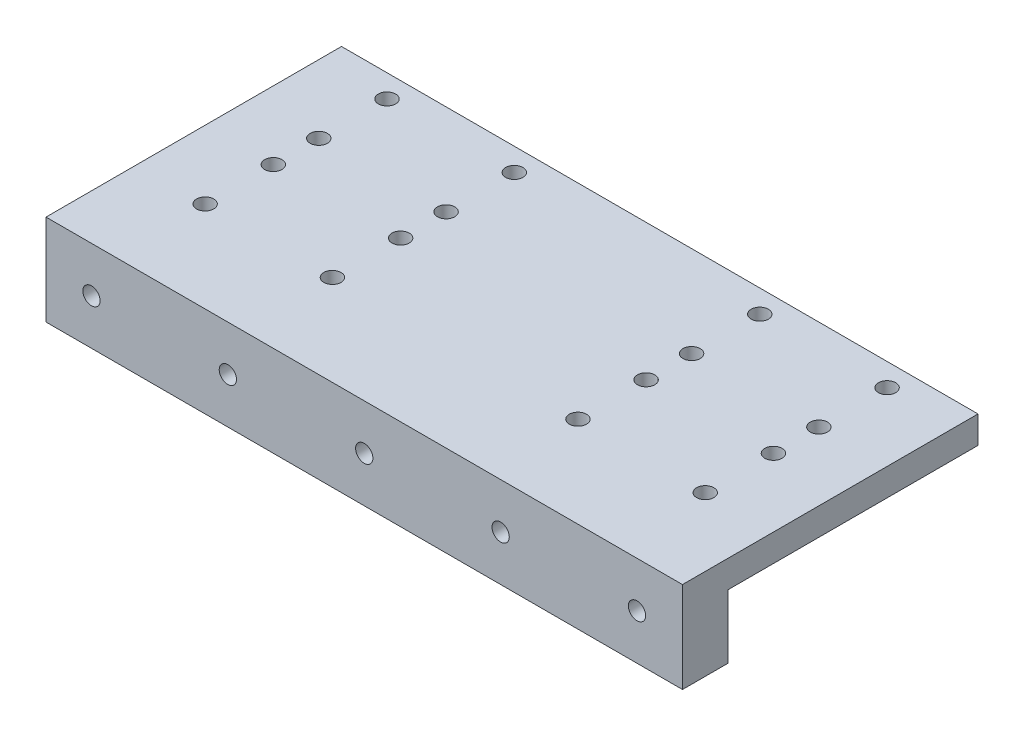
ISO-10303-21;
HEADER;
FILE_DESCRIPTION(('STEP AP214'),'2;1');
FILE_NAME('part.step','',(''),(''),'','','');
FILE_SCHEMA(('AUTOMOTIVE_DESIGN { 1 0 10303 214 1 1 1 1 }'));
ENDSEC;
DATA;
#1=APPLICATION_CONTEXT('core data for automotive mechanical design processes');
#2=APPLICATION_PROTOCOL_DEFINITION('international standard','automotive_design',2000,#1);
#3=PRODUCT_CONTEXT('',#1,'mechanical');
#4=PRODUCT('Part','Part','',(#3));
#5=PRODUCT_RELATED_PRODUCT_CATEGORY('part','',(#4));
#6=PRODUCT_DEFINITION_FORMATION('','',#4);
#7=PRODUCT_DEFINITION_CONTEXT('part definition',#1,'design');
#8=PRODUCT_DEFINITION('design','',#6,#7);
#9=PRODUCT_DEFINITION_SHAPE('','',#8);
#10=(LENGTH_UNIT() NAMED_UNIT(*) SI_UNIT(.MILLI.,.METRE.));
#11=(NAMED_UNIT(*) PLANE_ANGLE_UNIT() SI_UNIT($,.RADIAN.));
#12=(NAMED_UNIT(*) SI_UNIT($,.STERADIAN.) SOLID_ANGLE_UNIT());
#13=UNCERTAINTY_MEASURE_WITH_UNIT(LENGTH_MEASURE(1.E-05),#10,'distance_accuracy_value','');
#14=(GEOMETRIC_REPRESENTATION_CONTEXT(3) GLOBAL_UNCERTAINTY_ASSIGNED_CONTEXT((#13)) GLOBAL_UNIT_ASSIGNED_CONTEXT((#10,
#11,#12)) REPRESENTATION_CONTEXT('',''));
#15=CARTESIAN_POINT('',(0.,0.,0.));
#16=DIRECTION('',(0.,0.,1.));
#17=DIRECTION('',(1.,0.,0.));
#18=AXIS2_PLACEMENT_3D('',#15,#16,#17);
#19=CARTESIAN_POINT('',(0.,0.,10.));
#20=DIRECTION('',(0.,0.,1.));
#21=DIRECTION('',(1.,0.,0.));
#22=AXIS2_PLACEMENT_3D('',#19,#20,#21);
#23=PLANE('',#22);
#24=DIRECTION('',(0.,1.,0.));
#25=VECTOR('',#24,1.);
#26=CARTESIAN_POINT('',(140.,0.,10.));
#27=LINE('',#26,#25);
#28=CARTESIAN_POINT('',(140.,-20.,10.));
#29=VERTEX_POINT('',#28);
#30=CARTESIAN_POINT('',(140.,0.,10.));
#31=VERTEX_POINT('',#30);
#32=EDGE_CURVE('E181',#29,#31,#27,.T.);
#33=ORIENTED_EDGE('',*,*,#32,.T.);
#34=DIRECTION('',(-1.,0.,0.));
#35=VECTOR('',#34,1.);
#36=CARTESIAN_POINT('',(0.,0.,10.));
#37=LINE('',#36,#35);
#38=CARTESIAN_POINT('',(0.,0.,10.));
#39=VERTEX_POINT('',#38);
#40=EDGE_CURVE('E75',#31,#39,#37,.T.);
#41=ORIENTED_EDGE('',*,*,#40,.T.);
#42=DIRECTION('',(0.,-1.,0.));
#43=VECTOR('',#42,1.);
#44=CARTESIAN_POINT('',(0.,0.,10.));
#45=LINE('',#44,#43);
#46=CARTESIAN_POINT('',(0.,-20.,10.));
#47=VERTEX_POINT('',#46);
#48=EDGE_CURVE('E94',#39,#47,#45,.T.);
#49=ORIENTED_EDGE('',*,*,#48,.T.);
#50=DIRECTION('',(1.,0.,0.));
#51=VECTOR('',#50,1.);
#52=CARTESIAN_POINT('',(0.,-20.,10.));
#53=LINE('',#52,#51);
#54=EDGE_CURVE('E178',#47,#29,#53,.T.);
#55=ORIENTED_EDGE('',*,*,#54,.T.);
#56=EDGE_LOOP('',(#33,#41,#49,#55));
#57=FACE_BOUND('',#56,.T.);
#58=CARTESIAN_POINT('',(100.,-10.,10.));
#59=DIRECTION('',(0.,0.,1.));
#60=DIRECTION('',(1.,0.,0.));
#61=AXIS2_PLACEMENT_3D('',#58,#59,#60);
#62=CIRCLE('',#61,1.9);
#63=CARTESIAN_POINT('',(101.9,-10.,10.));
#64=VERTEX_POINT('',#63);
#65=EDGE_CURVE('E153',#64,#64,#62,.T.);
#66=ORIENTED_EDGE('',*,*,#65,.F.);
#67=EDGE_LOOP('',(#66));
#68=FACE_BOUND('',#67,.T.);
#69=CARTESIAN_POINT('',(40.,-10.,10.));
#70=DIRECTION('',(0.,0.,1.));
#71=DIRECTION('',(1.,0.,0.));
#72=AXIS2_PLACEMENT_3D('',#69,#70,#71);
#73=CIRCLE('',#72,1.9);
#74=CARTESIAN_POINT('',(41.9,-10.,10.));
#75=VERTEX_POINT('',#74);
#76=EDGE_CURVE('E165',#75,#75,#73,.T.);
#77=ORIENTED_EDGE('',*,*,#76,.F.);
#78=EDGE_LOOP('',(#77));
#79=FACE_BOUND('',#78,.T.);
#80=CARTESIAN_POINT('',(10.,-10.,10.));
#81=DIRECTION('',(0.,0.,1.));
#82=DIRECTION('',(1.,0.,0.));
#83=AXIS2_PLACEMENT_3D('',#80,#81,#82);
#84=CIRCLE('',#83,1.89999999999999);
#85=CARTESIAN_POINT('',(11.9,-10.,10.));
#86=VERTEX_POINT('',#85);
#87=EDGE_CURVE('E171',#86,#86,#84,.T.);
#88=ORIENTED_EDGE('',*,*,#87,.F.);
#89=EDGE_LOOP('',(#88));
#90=FACE_BOUND('',#89,.T.);
#91=CARTESIAN_POINT('',(70.,-10.,10.));
#92=DIRECTION('',(0.,0.,1.));
#93=DIRECTION('',(1.,0.,0.));
#94=AXIS2_PLACEMENT_3D('',#91,#92,#93);
#95=CIRCLE('',#94,1.9);
#96=CARTESIAN_POINT('',(71.9,-10.,10.));
#97=VERTEX_POINT('',#96);
#98=EDGE_CURVE('E159',#97,#97,#95,.T.);
#99=ORIENTED_EDGE('',*,*,#98,.F.);
#100=EDGE_LOOP('',(#99));
#101=FACE_BOUND('',#100,.T.);
#102=CARTESIAN_POINT('',(130.,-10.,10.));
#103=DIRECTION('',(0.,0.,1.));
#104=DIRECTION('',(1.,0.,0.));
#105=AXIS2_PLACEMENT_3D('',#102,#103,#104);
#106=CIRCLE('',#105,1.9);
#107=CARTESIAN_POINT('',(131.9,-10.,10.));
#108=VERTEX_POINT('',#107);
#109=EDGE_CURVE('E147',#108,#108,#106,.T.);
#110=ORIENTED_EDGE('',*,*,#109,.F.);
#111=EDGE_LOOP('',(#110));
#112=FACE_BOUND('',#111,.T.);
#113=ADVANCED_FACE('F51',(#57,#68,#79,#90,#101,#112),#23,.T.);
#114=CARTESIAN_POINT('',(0.,0.,0.));
#115=DIRECTION('',(0.,0.,1.));
#116=DIRECTION('',(1.,0.,0.));
#117=AXIS2_PLACEMENT_3D('',#114,#115,#116);
#118=PLANE('',#117);
#119=DIRECTION('',(0.,-1.,0.));
#120=VECTOR('',#119,1.);
#121=CARTESIAN_POINT('',(0.,0.,0.));
#122=LINE('',#121,#120);
#123=CARTESIAN_POINT('',(0.,-6.,0.));
#124=VERTEX_POINT('',#123);
#125=CARTESIAN_POINT('',(0.,-20.,0.));
#126=VERTEX_POINT('',#125);
#127=EDGE_CURVE('E174',#124,#126,#122,.T.);
#128=ORIENTED_EDGE('',*,*,#127,.F.);
#129=DIRECTION('',(1.,0.,0.));
#130=VECTOR('',#129,1.);
#131=CARTESIAN_POINT('',(0.,-6.,0.));
#132=LINE('',#131,#130);
#133=CARTESIAN_POINT('',(140.,-5.99999999999998,0.));
#134=VERTEX_POINT('',#133);
#135=EDGE_CURVE('E142',#124,#134,#132,.T.);
#136=ORIENTED_EDGE('',*,*,#135,.T.);
#137=DIRECTION('',(0.,1.,0.));
#138=VECTOR('',#137,1.);
#139=CARTESIAN_POINT('',(140.,0.,0.));
#140=LINE('',#139,#138);
#141=CARTESIAN_POINT('',(140.,-20.,0.));
#142=VERTEX_POINT('',#141);
#143=EDGE_CURVE('E179',#142,#134,#140,.T.);
#144=ORIENTED_EDGE('',*,*,#143,.F.);
#145=DIRECTION('',(1.,0.,0.));
#146=VECTOR('',#145,1.);
#147=CARTESIAN_POINT('',(0.,-20.,0.));
#148=LINE('',#147,#146);
#149=EDGE_CURVE('E89',#126,#142,#148,.T.);
#150=ORIENTED_EDGE('',*,*,#149,.F.);
#151=EDGE_LOOP('',(#128,#136,#144,#150));
#152=FACE_BOUND('',#151,.T.);
#153=CARTESIAN_POINT('',(10.,-10.,0.));
#154=DIRECTION('',(0.,0.,1.));
#155=DIRECTION('',(1.,0.,0.));
#156=AXIS2_PLACEMENT_3D('',#153,#154,#155);
#157=CIRCLE('',#156,1.89999999999999);
#158=CARTESIAN_POINT('',(11.9,-10.,0.));
#159=VERTEX_POINT('',#158);
#160=EDGE_CURVE('E168',#159,#159,#157,.T.);
#161=ORIENTED_EDGE('',*,*,#160,.T.);
#162=EDGE_LOOP('',(#161));
#163=FACE_BOUND('',#162,.T.);
#164=CARTESIAN_POINT('',(40.,-10.,0.));
#165=DIRECTION('',(0.,0.,1.));
#166=DIRECTION('',(1.,0.,0.));
#167=AXIS2_PLACEMENT_3D('',#164,#165,#166);
#168=CIRCLE('',#167,1.9);
#169=CARTESIAN_POINT('',(41.9,-10.,0.));
#170=VERTEX_POINT('',#169);
#171=EDGE_CURVE('E162',#170,#170,#168,.T.);
#172=ORIENTED_EDGE('',*,*,#171,.T.);
#173=EDGE_LOOP('',(#172));
#174=FACE_BOUND('',#173,.T.);
#175=CARTESIAN_POINT('',(70.,-10.,0.));
#176=DIRECTION('',(0.,0.,1.));
#177=DIRECTION('',(1.,0.,0.));
#178=AXIS2_PLACEMENT_3D('',#175,#176,#177);
#179=CIRCLE('',#178,1.9);
#180=CARTESIAN_POINT('',(71.9,-10.,0.));
#181=VERTEX_POINT('',#180);
#182=EDGE_CURVE('E156',#181,#181,#179,.T.);
#183=ORIENTED_EDGE('',*,*,#182,.T.);
#184=EDGE_LOOP('',(#183));
#185=FACE_BOUND('',#184,.T.);
#186=CARTESIAN_POINT('',(100.,-10.,0.));
#187=DIRECTION('',(0.,0.,1.));
#188=DIRECTION('',(1.,0.,0.));
#189=AXIS2_PLACEMENT_3D('',#186,#187,#188);
#190=CIRCLE('',#189,1.9);
#191=CARTESIAN_POINT('',(101.9,-10.,0.));
#192=VERTEX_POINT('',#191);
#193=EDGE_CURVE('E150',#192,#192,#190,.T.);
#194=ORIENTED_EDGE('',*,*,#193,.T.);
#195=EDGE_LOOP('',(#194));
#196=FACE_BOUND('',#195,.T.);
#197=CARTESIAN_POINT('',(130.,-10.,0.));
#198=DIRECTION('',(0.,0.,1.));
#199=DIRECTION('',(1.,0.,0.));
#200=AXIS2_PLACEMENT_3D('',#197,#198,#199);
#201=CIRCLE('',#200,1.9);
#202=CARTESIAN_POINT('',(131.9,-10.,0.));
#203=VERTEX_POINT('',#202);
#204=EDGE_CURVE('E146',#203,#203,#201,.T.);
#205=ORIENTED_EDGE('',*,*,#204,.T.);
#206=EDGE_LOOP('',(#205));
#207=FACE_BOUND('',#206,.T.);
#208=ADVANCED_FACE('F190',(#152,#163,#174,#185,#196,#207),#118,.F.);
#209=CARTESIAN_POINT('',(0.,0.,10.));
#210=DIRECTION('',(1.,0.,0.));
#211=DIRECTION('',(0.,1.,0.));
#212=AXIS2_PLACEMENT_3D('',#209,#210,#211);
#213=PLANE('',#212);
#214=DIRECTION('',(0.,0.,-1.));
#215=VECTOR('',#214,1.);
#216=CARTESIAN_POINT('',(0.,-20.,10.));
#217=LINE('',#216,#215);
#218=EDGE_CURVE('E12',#47,#126,#217,.T.);
#219=ORIENTED_EDGE('',*,*,#218,.F.);
#220=ORIENTED_EDGE('',*,*,#48,.F.);
#221=DIRECTION('',(0.,0.,-1.));
#222=VECTOR('',#221,1.);
#223=CARTESIAN_POINT('',(0.,0.,10.));
#224=LINE('',#223,#222);
#225=CARTESIAN_POINT('',(0.,0.,-55.));
#226=VERTEX_POINT('',#225);
#227=EDGE_CURVE('E121',#39,#226,#224,.T.);
#228=ORIENTED_EDGE('',*,*,#227,.T.);
#229=DIRECTION('',(0.,-1.,0.));
#230=VECTOR('',#229,1.);
#231=CARTESIAN_POINT('',(0.,0.,-55.));
#232=LINE('',#231,#230);
#233=CARTESIAN_POINT('',(0.,-6.00000000000001,-55.));
#234=VERTEX_POINT('',#233);
#235=EDGE_CURVE('E128',#226,#234,#232,.T.);
#236=ORIENTED_EDGE('',*,*,#235,.T.);
#237=DIRECTION('',(0.,0.,1.));
#238=VECTOR('',#237,1.);
#239=CARTESIAN_POINT('',(0.,-6.,10.));
#240=LINE('',#239,#238);
#241=EDGE_CURVE('E66',#234,#124,#240,.T.);
#242=ORIENTED_EDGE('',*,*,#241,.T.);
#243=ORIENTED_EDGE('',*,*,#127,.T.);
#244=EDGE_LOOP('',(#219,#220,#228,#236,#242,#243));
#245=FACE_BOUND('',#244,.T.);
#246=ADVANCED_FACE('F53',(#245),#213,.F.);
#247=CARTESIAN_POINT('',(0.,-20.,10.));
#248=DIRECTION('',(0.,1.,0.));
#249=DIRECTION('',(0.,0.,1.));
#250=AXIS2_PLACEMENT_3D('',#247,#248,#249);
#251=PLANE('',#250);
#252=ORIENTED_EDGE('',*,*,#149,.T.);
#253=DIRECTION('',(0.,0.,-1.));
#254=VECTOR('',#253,1.);
#255=CARTESIAN_POINT('',(140.,-20.,10.));
#256=LINE('',#255,#254);
#257=EDGE_CURVE('E59',#29,#142,#256,.T.);
#258=ORIENTED_EDGE('',*,*,#257,.F.);
#259=ORIENTED_EDGE('',*,*,#54,.F.);
#260=ORIENTED_EDGE('',*,*,#218,.T.);
#261=EDGE_LOOP('',(#252,#258,#259,#260));
#262=FACE_BOUND('',#261,.T.);
#263=ADVANCED_FACE('F195',(#262),#251,.F.);
#264=CARTESIAN_POINT('',(140.,0.,10.));
#265=DIRECTION('',(-1.,0.,0.));
#266=DIRECTION('',(0.,0.,1.));
#267=AXIS2_PLACEMENT_3D('',#264,#265,#266);
#268=PLANE('',#267);
#269=ORIENTED_EDGE('',*,*,#143,.T.);
#270=DIRECTION('',(0.,0.,1.));
#271=VECTOR('',#270,1.);
#272=CARTESIAN_POINT('',(140.,-5.99999999999998,10.));
#273=LINE('',#272,#271);
#274=CARTESIAN_POINT('',(140.,-5.99999999999999,-55.));
#275=VERTEX_POINT('',#274);
#276=EDGE_CURVE('E130',#275,#134,#273,.T.);
#277=ORIENTED_EDGE('',*,*,#276,.F.);
#278=DIRECTION('',(0.,-1.,0.));
#279=VECTOR('',#278,1.);
#280=CARTESIAN_POINT('',(140.,0.,-55.));
#281=LINE('',#280,#279);
#282=CARTESIAN_POINT('',(140.,0.,-55.));
#283=VERTEX_POINT('',#282);
#284=EDGE_CURVE('E126',#283,#275,#281,.T.);
#285=ORIENTED_EDGE('',*,*,#284,.F.);
#286=DIRECTION('',(0.,0.,-1.));
#287=VECTOR('',#286,1.);
#288=CARTESIAN_POINT('',(140.,0.,10.));
#289=LINE('',#288,#287);
#290=EDGE_CURVE('E113',#31,#283,#289,.T.);
#291=ORIENTED_EDGE('',*,*,#290,.F.);
#292=ORIENTED_EDGE('',*,*,#32,.F.);
#293=ORIENTED_EDGE('',*,*,#257,.T.);
#294=EDGE_LOOP('',(#269,#277,#285,#291,#292,#293));
#295=FACE_BOUND('',#294,.T.);
#296=ADVANCED_FACE('F133',(#295),#268,.F.);
#297=CARTESIAN_POINT('',(0.,0.,10.));
#298=DIRECTION('',(0.,-1.,0.));
#299=DIRECTION('',(0.,0.,-1.));
#300=AXIS2_PLACEMENT_3D('',#297,#298,#299);
#301=PLANE('',#300);
#302=CARTESIAN_POINT('',(43.,0.,-50.));
#303=DIRECTION('',(0.,-1.,0.));
#304=DIRECTION('',(0.,0.,-1.));
#305=AXIS2_PLACEMENT_3D('',#302,#303,#304);
#306=CIRCLE('',#305,1.9);
#307=CARTESIAN_POINT('',(43.,0.,-51.9));
#308=VERTEX_POINT('',#307);
#309=EDGE_CURVE('E138',#308,#308,#306,.T.);
#310=ORIENTED_EDGE('',*,*,#309,.T.);
#311=EDGE_LOOP('',(#310));
#312=FACE_BOUND('',#311,.T.);
#313=CARTESIAN_POINT('',(15.,0.,-50.));
#314=DIRECTION('',(0.,-1.,0.));
#315=DIRECTION('',(0.,0.,-1.));
#316=AXIS2_PLACEMENT_3D('',#313,#314,#315);
#317=CIRCLE('',#316,1.9);
#318=CARTESIAN_POINT('',(15.,0.,-51.9));
#319=VERTEX_POINT('',#318);
#320=EDGE_CURVE('E559',#319,#319,#317,.T.);
#321=ORIENTED_EDGE('',*,*,#320,.T.);
#322=EDGE_LOOP('',(#321));
#323=FACE_BOUND('',#322,.T.);
#324=CARTESIAN_POINT('',(15.,0.,-35.));
#325=DIRECTION('',(0.,-1.,0.));
#326=DIRECTION('',(0.,0.,-1.));
#327=AXIS2_PLACEMENT_3D('',#324,#325,#326);
#328=CIRCLE('',#327,1.9);
#329=CARTESIAN_POINT('',(15.,0.,-36.9));
#330=VERTEX_POINT('',#329);
#331=EDGE_CURVE('E561',#330,#330,#328,.T.);
#332=ORIENTED_EDGE('',*,*,#331,.T.);
#333=EDGE_LOOP('',(#332));
#334=FACE_BOUND('',#333,.T.);
#335=CARTESIAN_POINT('',(15.,0.,-10.));
#336=DIRECTION('',(0.,-1.,0.));
#337=DIRECTION('',(0.,0.,-1.));
#338=AXIS2_PLACEMENT_3D('',#335,#336,#337);
#339=CIRCLE('',#338,1.9);
#340=CARTESIAN_POINT('',(15.,0.,-11.9));
#341=VERTEX_POINT('',#340);
#342=EDGE_CURVE('E565',#341,#341,#339,.T.);
#343=ORIENTED_EDGE('',*,*,#342,.T.);
#344=EDGE_LOOP('',(#343));
#345=FACE_BOUND('',#344,.T.);
#346=CARTESIAN_POINT('',(15.,0.,-25.));
#347=DIRECTION('',(0.,-1.,0.));
#348=DIRECTION('',(0.,0.,-1.));
#349=AXIS2_PLACEMENT_3D('',#346,#347,#348);
#350=CIRCLE('',#349,1.9);
#351=CARTESIAN_POINT('',(15.,0.,-26.9));
#352=VERTEX_POINT('',#351);
#353=EDGE_CURVE('E570',#352,#352,#350,.T.);
#354=ORIENTED_EDGE('',*,*,#353,.T.);
#355=EDGE_LOOP('',(#354));
#356=FACE_BOUND('',#355,.T.);
#357=CARTESIAN_POINT('',(43.,0.,-25.));
#358=DIRECTION('',(0.,-1.,0.));
#359=DIRECTION('',(0.,0.,-1.));
#360=AXIS2_PLACEMENT_3D('',#357,#358,#359);
#361=CIRCLE('',#360,1.9);
#362=CARTESIAN_POINT('',(43.,0.,-26.9));
#363=VERTEX_POINT('',#362);
#364=EDGE_CURVE('E573',#363,#363,#361,.T.);
#365=ORIENTED_EDGE('',*,*,#364,.T.);
#366=EDGE_LOOP('',(#365));
#367=FACE_BOUND('',#366,.T.);
#368=CARTESIAN_POINT('',(43.,0.,-10.));
#369=DIRECTION('',(0.,-1.,0.));
#370=DIRECTION('',(0.,0.,-1.));
#371=AXIS2_PLACEMENT_3D('',#368,#369,#370);
#372=CIRCLE('',#371,1.9);
#373=CARTESIAN_POINT('',(43.,0.,-11.9));
#374=VERTEX_POINT('',#373);
#375=EDGE_CURVE('E576',#374,#374,#372,.T.);
#376=ORIENTED_EDGE('',*,*,#375,.T.);
#377=EDGE_LOOP('',(#376));
#378=FACE_BOUND('',#377,.T.);
#379=CARTESIAN_POINT('',(125.,0.,-35.));
#380=DIRECTION('',(0.,-1.,0.));
#381=DIRECTION('',(0.,0.,-1.));
#382=AXIS2_PLACEMENT_3D('',#379,#380,#381);
#383=CIRCLE('',#382,1.9);
#384=CARTESIAN_POINT('',(125.,0.,-36.9));
#385=VERTEX_POINT('',#384);
#386=EDGE_CURVE('E579',#385,#385,#383,.T.);
#387=ORIENTED_EDGE('',*,*,#386,.T.);
#388=EDGE_LOOP('',(#387));
#389=FACE_BOUND('',#388,.T.);
#390=CARTESIAN_POINT('',(125.,0.,-25.));
#391=DIRECTION('',(0.,-1.,0.));
#392=DIRECTION('',(0.,0.,-1.));
#393=AXIS2_PLACEMENT_3D('',#390,#391,#392);
#394=CIRCLE('',#393,1.9);
#395=CARTESIAN_POINT('',(125.,0.,-26.9));
#396=VERTEX_POINT('',#395);
#397=EDGE_CURVE('E582',#396,#396,#394,.T.);
#398=ORIENTED_EDGE('',*,*,#397,.T.);
#399=EDGE_LOOP('',(#398));
#400=FACE_BOUND('',#399,.T.);
#401=CARTESIAN_POINT('',(125.,0.,-10.));
#402=DIRECTION('',(0.,-1.,0.));
#403=DIRECTION('',(0.,0.,-1.));
#404=AXIS2_PLACEMENT_3D('',#401,#402,#403);
#405=CIRCLE('',#404,1.9);
#406=CARTESIAN_POINT('',(125.,0.,-11.9));
#407=VERTEX_POINT('',#406);
#408=EDGE_CURVE('E585',#407,#407,#405,.T.);
#409=ORIENTED_EDGE('',*,*,#408,.T.);
#410=EDGE_LOOP('',(#409));
#411=FACE_BOUND('',#410,.T.);
#412=CARTESIAN_POINT('',(97.,0.,-25.));
#413=DIRECTION('',(0.,-1.,0.));
#414=DIRECTION('',(0.,0.,-1.));
#415=AXIS2_PLACEMENT_3D('',#412,#413,#414);
#416=CIRCLE('',#415,1.9);
#417=CARTESIAN_POINT('',(97.,0.,-26.9));
#418=VERTEX_POINT('',#417);
#419=EDGE_CURVE('E588',#418,#418,#416,.T.);
#420=ORIENTED_EDGE('',*,*,#419,.T.);
#421=EDGE_LOOP('',(#420));
#422=FACE_BOUND('',#421,.T.);
#423=CARTESIAN_POINT('',(125.,0.,-50.));
#424=DIRECTION('',(0.,-1.,0.));
#425=DIRECTION('',(0.,0.,-1.));
#426=AXIS2_PLACEMENT_3D('',#423,#424,#425);
#427=CIRCLE('',#426,1.9);
#428=CARTESIAN_POINT('',(125.,0.,-51.9));
#429=VERTEX_POINT('',#428);
#430=EDGE_CURVE('E591',#429,#429,#427,.T.);
#431=ORIENTED_EDGE('',*,*,#430,.T.);
#432=EDGE_LOOP('',(#431));
#433=FACE_BOUND('',#432,.T.);
#434=CARTESIAN_POINT('',(97.,0.,-50.));
#435=DIRECTION('',(0.,-1.,0.));
#436=DIRECTION('',(0.,0.,-1.));
#437=AXIS2_PLACEMENT_3D('',#434,#435,#436);
#438=CIRCLE('',#437,1.9);
#439=CARTESIAN_POINT('',(97.,0.,-51.9));
#440=VERTEX_POINT('',#439);
#441=EDGE_CURVE('E594',#440,#440,#438,.T.);
#442=ORIENTED_EDGE('',*,*,#441,.T.);
#443=EDGE_LOOP('',(#442));
#444=FACE_BOUND('',#443,.T.);
#445=CARTESIAN_POINT('',(97.,0.,-35.));
#446=DIRECTION('',(0.,-1.,0.));
#447=DIRECTION('',(0.,0.,-1.));
#448=AXIS2_PLACEMENT_3D('',#445,#446,#447);
#449=CIRCLE('',#448,1.9);
#450=CARTESIAN_POINT('',(97.,0.,-36.9));
#451=VERTEX_POINT('',#450);
#452=EDGE_CURVE('E597',#451,#451,#449,.T.);
#453=ORIENTED_EDGE('',*,*,#452,.T.);
#454=EDGE_LOOP('',(#453));
#455=FACE_BOUND('',#454,.T.);
#456=CARTESIAN_POINT('',(97.,0.,-10.));
#457=DIRECTION('',(0.,-1.,0.));
#458=DIRECTION('',(0.,0.,-1.));
#459=AXIS2_PLACEMENT_3D('',#456,#457,#458);
#460=CIRCLE('',#459,1.9);
#461=CARTESIAN_POINT('',(97.,0.,-11.9));
#462=VERTEX_POINT('',#461);
#463=EDGE_CURVE('E600',#462,#462,#460,.T.);
#464=ORIENTED_EDGE('',*,*,#463,.T.);
#465=EDGE_LOOP('',(#464));
#466=FACE_BOUND('',#465,.T.);
#467=CARTESIAN_POINT('',(43.,0.,-35.));
#468=DIRECTION('',(0.,-1.,0.));
#469=DIRECTION('',(0.,0.,-1.));
#470=AXIS2_PLACEMENT_3D('',#467,#468,#469);
#471=CIRCLE('',#470,1.9);
#472=CARTESIAN_POINT('',(43.,0.,-36.9));
#473=VERTEX_POINT('',#472);
#474=EDGE_CURVE('E603',#473,#473,#471,.T.);
#475=ORIENTED_EDGE('',*,*,#474,.T.);
#476=EDGE_LOOP('',(#475));
#477=FACE_BOUND('',#476,.T.);
#478=ORIENTED_EDGE('',*,*,#290,.T.);
#479=DIRECTION('',(-1.,0.,0.));
#480=VECTOR('',#479,1.);
#481=CARTESIAN_POINT('',(140.,0.,-55.));
#482=LINE('',#481,#480);
#483=EDGE_CURVE('E116',#283,#226,#482,.T.);
#484=ORIENTED_EDGE('',*,*,#483,.T.);
#485=ORIENTED_EDGE('',*,*,#227,.F.);
#486=ORIENTED_EDGE('',*,*,#40,.F.);
#487=EDGE_LOOP('',(#478,#484,#485,#486));
#488=FACE_BOUND('',#487,.T.);
#489=ADVANCED_FACE('F115',(#312,#323,#334,#345,#356,#367,#378,#389,#400,#411,#422,#433,#444,
#455,#466,#477,#488),#301,.F.);
#490=CARTESIAN_POINT('',(10.,-10.,10.));
#491=DIRECTION('',(0.,0.,-1.));
#492=DIRECTION('',(-1.,0.,0.));
#493=AXIS2_PLACEMENT_3D('',#490,#491,#492);
#494=CYLINDRICAL_SURFACE('',#493,1.89999999999999);
#495=ORIENTED_EDGE('',*,*,#87,.T.);
#496=EDGE_LOOP('',(#495));
#497=FACE_BOUND('',#496,.T.);
#498=ORIENTED_EDGE('',*,*,#160,.F.);
#499=EDGE_LOOP('',(#498));
#500=FACE_BOUND('',#499,.T.);
#501=ADVANCED_FACE('F225',(#497,#500),#494,.F.);
#502=CARTESIAN_POINT('',(40.,-10.,10.));
#503=DIRECTION('',(0.,0.,-1.));
#504=DIRECTION('',(-1.,0.,0.));
#505=AXIS2_PLACEMENT_3D('',#502,#503,#504);
#506=CYLINDRICAL_SURFACE('',#505,1.9);
#507=ORIENTED_EDGE('',*,*,#76,.T.);
#508=EDGE_LOOP('',(#507));
#509=FACE_BOUND('',#508,.T.);
#510=ORIENTED_EDGE('',*,*,#171,.F.);
#511=EDGE_LOOP('',(#510));
#512=FACE_BOUND('',#511,.T.);
#513=ADVANCED_FACE('F249',(#509,#512),#506,.F.);
#514=CARTESIAN_POINT('',(70.,-10.,10.));
#515=DIRECTION('',(0.,0.,-1.));
#516=DIRECTION('',(-1.,0.,0.));
#517=AXIS2_PLACEMENT_3D('',#514,#515,#516);
#518=CYLINDRICAL_SURFACE('',#517,1.9);
#519=ORIENTED_EDGE('',*,*,#98,.T.);
#520=EDGE_LOOP('',(#519));
#521=FACE_BOUND('',#520,.T.);
#522=ORIENTED_EDGE('',*,*,#182,.F.);
#523=EDGE_LOOP('',(#522));
#524=FACE_BOUND('',#523,.T.);
#525=ADVANCED_FACE('F256',(#521,#524),#518,.F.);
#526=CARTESIAN_POINT('',(100.,-10.,10.));
#527=DIRECTION('',(0.,0.,-1.));
#528=DIRECTION('',(-1.,0.,0.));
#529=AXIS2_PLACEMENT_3D('',#526,#527,#528);
#530=CYLINDRICAL_SURFACE('',#529,1.9);
#531=ORIENTED_EDGE('',*,*,#65,.T.);
#532=EDGE_LOOP('',(#531));
#533=FACE_BOUND('',#532,.T.);
#534=ORIENTED_EDGE('',*,*,#193,.F.);
#535=EDGE_LOOP('',(#534));
#536=FACE_BOUND('',#535,.T.);
#537=ADVANCED_FACE('F212',(#533,#536),#530,.F.);
#538=CARTESIAN_POINT('',(130.,-10.,10.));
#539=DIRECTION('',(0.,0.,-1.));
#540=DIRECTION('',(-1.,0.,0.));
#541=AXIS2_PLACEMENT_3D('',#538,#539,#540);
#542=CYLINDRICAL_SURFACE('',#541,1.9);
#543=ORIENTED_EDGE('',*,*,#109,.T.);
#544=EDGE_LOOP('',(#543));
#545=FACE_BOUND('',#544,.T.);
#546=ORIENTED_EDGE('',*,*,#204,.F.);
#547=EDGE_LOOP('',(#546));
#548=FACE_BOUND('',#547,.T.);
#549=ADVANCED_FACE('F209',(#545,#548),#542,.F.);
#550=CARTESIAN_POINT('',(140.,-5.99999999999998,10.));
#551=DIRECTION('',(0.,-1.,0.));
#552=DIRECTION('',(1.,0.,0.));
#553=AXIS2_PLACEMENT_3D('',#550,#551,#552);
#554=PLANE('',#553);
#555=CARTESIAN_POINT('',(43.,-6.,-50.));
#556=DIRECTION('',(0.,-1.,0.));
#557=DIRECTION('',(0.,0.,-1.));
#558=AXIS2_PLACEMENT_3D('',#555,#556,#557);
#559=CIRCLE('',#558,1.9);
#560=CARTESIAN_POINT('',(43.,-6.,-51.9));
#561=VERTEX_POINT('',#560);
#562=EDGE_CURVE('E556',#561,#561,#559,.T.);
#563=ORIENTED_EDGE('',*,*,#562,.F.);
#564=EDGE_LOOP('',(#563));
#565=FACE_BOUND('',#564,.T.);
#566=CARTESIAN_POINT('',(15.,-6.00000000000001,-50.));
#567=DIRECTION('',(0.,-1.,0.));
#568=DIRECTION('',(0.,0.,-1.));
#569=AXIS2_PLACEMENT_3D('',#566,#567,#568);
#570=CIRCLE('',#569,1.9);
#571=CARTESIAN_POINT('',(15.,-6.00000000000001,-51.9));
#572=VERTEX_POINT('',#571);
#573=EDGE_CURVE('E611',#572,#572,#570,.T.);
#574=ORIENTED_EDGE('',*,*,#573,.F.);
#575=EDGE_LOOP('',(#574));
#576=FACE_BOUND('',#575,.T.);
#577=CARTESIAN_POINT('',(15.,-6.,-35.));
#578=DIRECTION('',(0.,-1.,0.));
#579=DIRECTION('',(0.,0.,-1.));
#580=AXIS2_PLACEMENT_3D('',#577,#578,#579);
#581=CIRCLE('',#580,1.9);
#582=CARTESIAN_POINT('',(15.,-6.,-36.9));
#583=VERTEX_POINT('',#582);
#584=EDGE_CURVE('E614',#583,#583,#581,.T.);
#585=ORIENTED_EDGE('',*,*,#584,.F.);
#586=EDGE_LOOP('',(#585));
#587=FACE_BOUND('',#586,.T.);
#588=CARTESIAN_POINT('',(15.,-6.,-10.));
#589=DIRECTION('',(0.,-1.,0.));
#590=DIRECTION('',(0.,0.,-1.));
#591=AXIS2_PLACEMENT_3D('',#588,#589,#590);
#592=CIRCLE('',#591,1.9);
#593=CARTESIAN_POINT('',(15.,-6.,-11.9));
#594=VERTEX_POINT('',#593);
#595=EDGE_CURVE('E617',#594,#594,#592,.T.);
#596=ORIENTED_EDGE('',*,*,#595,.F.);
#597=EDGE_LOOP('',(#596));
#598=FACE_BOUND('',#597,.T.);
#599=CARTESIAN_POINT('',(15.,-6.,-25.));
#600=DIRECTION('',(0.,-1.,0.));
#601=DIRECTION('',(0.,0.,-1.));
#602=AXIS2_PLACEMENT_3D('',#599,#600,#601);
#603=CIRCLE('',#602,1.9);
#604=CARTESIAN_POINT('',(15.,-6.,-26.9));
#605=VERTEX_POINT('',#604);
#606=EDGE_CURVE('E620',#605,#605,#603,.T.);
#607=ORIENTED_EDGE('',*,*,#606,.F.);
#608=EDGE_LOOP('',(#607));
#609=FACE_BOUND('',#608,.T.);
#610=CARTESIAN_POINT('',(43.,-6.,-25.));
#611=DIRECTION('',(0.,-1.,0.));
#612=DIRECTION('',(0.,0.,-1.));
#613=AXIS2_PLACEMENT_3D('',#610,#611,#612);
#614=CIRCLE('',#613,1.9);
#615=CARTESIAN_POINT('',(43.,-6.,-26.9));
#616=VERTEX_POINT('',#615);
#617=EDGE_CURVE('E623',#616,#616,#614,.T.);
#618=ORIENTED_EDGE('',*,*,#617,.F.);
#619=EDGE_LOOP('',(#618));
#620=FACE_BOUND('',#619,.T.);
#621=CARTESIAN_POINT('',(43.,-6.,-10.));
#622=DIRECTION('',(0.,-1.,0.));
#623=DIRECTION('',(0.,0.,-1.));
#624=AXIS2_PLACEMENT_3D('',#621,#622,#623);
#625=CIRCLE('',#624,1.9);
#626=CARTESIAN_POINT('',(43.,-6.,-11.9));
#627=VERTEX_POINT('',#626);
#628=EDGE_CURVE('E626',#627,#627,#625,.T.);
#629=ORIENTED_EDGE('',*,*,#628,.F.);
#630=EDGE_LOOP('',(#629));
#631=FACE_BOUND('',#630,.T.);
#632=CARTESIAN_POINT('',(125.,-5.99999999999999,-35.));
#633=DIRECTION('',(0.,-1.,0.));
#634=DIRECTION('',(0.,0.,-1.));
#635=AXIS2_PLACEMENT_3D('',#632,#633,#634);
#636=CIRCLE('',#635,1.9);
#637=CARTESIAN_POINT('',(125.,-5.99999999999999,-36.9));
#638=VERTEX_POINT('',#637);
#639=EDGE_CURVE('E636',#638,#638,#636,.T.);
#640=ORIENTED_EDGE('',*,*,#639,.F.);
#641=EDGE_LOOP('',(#640));
#642=FACE_BOUND('',#641,.T.);
#643=CARTESIAN_POINT('',(125.,-5.99999999999999,-25.));
#644=DIRECTION('',(0.,-1.,0.));
#645=DIRECTION('',(0.,0.,-1.));
#646=AXIS2_PLACEMENT_3D('',#643,#644,#645);
#647=CIRCLE('',#646,1.9);
#648=CARTESIAN_POINT('',(125.,-5.99999999999999,-26.9));
#649=VERTEX_POINT('',#648);
#650=EDGE_CURVE('E633',#649,#649,#647,.T.);
#651=ORIENTED_EDGE('',*,*,#650,.F.);
#652=EDGE_LOOP('',(#651));
#653=FACE_BOUND('',#652,.T.);
#654=CARTESIAN_POINT('',(125.,-5.99999999999999,-10.));
#655=DIRECTION('',(0.,-1.,0.));
#656=DIRECTION('',(0.,0.,-1.));
#657=AXIS2_PLACEMENT_3D('',#654,#655,#656);
#658=CIRCLE('',#657,1.9);
#659=CARTESIAN_POINT('',(125.,-5.99999999999999,-11.9));
#660=VERTEX_POINT('',#659);
#661=EDGE_CURVE('E630',#660,#660,#658,.T.);
#662=ORIENTED_EDGE('',*,*,#661,.F.);
#663=EDGE_LOOP('',(#662));
#664=FACE_BOUND('',#663,.T.);
#665=CARTESIAN_POINT('',(97.,-5.99999999999999,-25.));
#666=DIRECTION('',(0.,-1.,0.));
#667=DIRECTION('',(0.,0.,-1.));
#668=AXIS2_PLACEMENT_3D('',#665,#666,#667);
#669=CIRCLE('',#668,1.9);
#670=CARTESIAN_POINT('',(97.,-5.99999999999999,-26.9));
#671=VERTEX_POINT('',#670);
#672=EDGE_CURVE('E609',#671,#671,#669,.T.);
#673=ORIENTED_EDGE('',*,*,#672,.F.);
#674=EDGE_LOOP('',(#673));
#675=FACE_BOUND('',#674,.T.);
#676=CARTESIAN_POINT('',(125.,-5.99999999999999,-50.));
#677=DIRECTION('',(0.,-1.,0.));
#678=DIRECTION('',(0.,0.,-1.));
#679=AXIS2_PLACEMENT_3D('',#676,#677,#678);
#680=CIRCLE('',#679,1.9);
#681=CARTESIAN_POINT('',(125.,-5.99999999999999,-51.9));
#682=VERTEX_POINT('',#681);
#683=EDGE_CURVE('E639',#682,#682,#680,.T.);
#684=ORIENTED_EDGE('',*,*,#683,.F.);
#685=EDGE_LOOP('',(#684));
#686=FACE_BOUND('',#685,.T.);
#687=CARTESIAN_POINT('',(97.,-6.,-50.));
#688=DIRECTION('',(0.,-1.,0.));
#689=DIRECTION('',(0.,0.,-1.));
#690=AXIS2_PLACEMENT_3D('',#687,#688,#689);
#691=CIRCLE('',#690,1.9);
#692=CARTESIAN_POINT('',(97.,-6.,-51.9));
#693=VERTEX_POINT('',#692);
#694=EDGE_CURVE('E647',#693,#693,#691,.T.);
#695=ORIENTED_EDGE('',*,*,#694,.F.);
#696=EDGE_LOOP('',(#695));
#697=FACE_BOUND('',#696,.T.);
#698=CARTESIAN_POINT('',(97.,-5.99999999999999,-35.));
#699=DIRECTION('',(0.,-1.,0.));
#700=DIRECTION('',(0.,0.,-1.));
#701=AXIS2_PLACEMENT_3D('',#698,#699,#700);
#702=CIRCLE('',#701,1.9);
#703=CARTESIAN_POINT('',(97.,-5.99999999999999,-36.9));
#704=VERTEX_POINT('',#703);
#705=EDGE_CURVE('E644',#704,#704,#702,.T.);
#706=ORIENTED_EDGE('',*,*,#705,.F.);
#707=EDGE_LOOP('',(#706));
#708=FACE_BOUND('',#707,.T.);
#709=CARTESIAN_POINT('',(97.,-5.99999999999999,-10.));
#710=DIRECTION('',(0.,-1.,0.));
#711=DIRECTION('',(0.,0.,-1.));
#712=AXIS2_PLACEMENT_3D('',#709,#710,#711);
#713=CIRCLE('',#712,1.9);
#714=CARTESIAN_POINT('',(97.,-5.99999999999999,-11.9));
#715=VERTEX_POINT('',#714);
#716=EDGE_CURVE('E629',#715,#715,#713,.T.);
#717=ORIENTED_EDGE('',*,*,#716,.F.);
#718=EDGE_LOOP('',(#717));
#719=FACE_BOUND('',#718,.T.);
#720=CARTESIAN_POINT('',(43.,-6.,-35.));
#721=DIRECTION('',(0.,-1.,0.));
#722=DIRECTION('',(0.,0.,-1.));
#723=AXIS2_PLACEMENT_3D('',#720,#721,#722);
#724=CIRCLE('',#723,1.9);
#725=CARTESIAN_POINT('',(43.,-6.,-36.9));
#726=VERTEX_POINT('',#725);
#727=EDGE_CURVE('E606',#726,#726,#724,.T.);
#728=ORIENTED_EDGE('',*,*,#727,.F.);
#729=EDGE_LOOP('',(#728));
#730=FACE_BOUND('',#729,.T.);
#731=ORIENTED_EDGE('',*,*,#135,.F.);
#732=ORIENTED_EDGE('',*,*,#241,.F.);
#733=DIRECTION('',(-1.,0.,0.));
#734=VECTOR('',#733,1.);
#735=CARTESIAN_POINT('',(140.,-5.99999999999999,-55.));
#736=LINE('',#735,#734);
#737=EDGE_CURVE('E129',#275,#234,#736,.T.);
#738=ORIENTED_EDGE('',*,*,#737,.F.);
#739=ORIENTED_EDGE('',*,*,#276,.T.);
#740=EDGE_LOOP('',(#731,#732,#738,#739));
#741=FACE_BOUND('',#740,.T.);
#742=ADVANCED_FACE('F193',(#565,#576,#587,#598,#609,#620,#631,#642,#653,#664,#675,#686,#697,
#708,#719,#730,#741),#554,.T.);
#743=CARTESIAN_POINT('',(140.,0.,-55.));
#744=DIRECTION('',(0.,0.,-1.));
#745=DIRECTION('',(-1.,0.,0.));
#746=AXIS2_PLACEMENT_3D('',#743,#744,#745);
#747=PLANE('',#746);
#748=ORIENTED_EDGE('',*,*,#235,.F.);
#749=ORIENTED_EDGE('',*,*,#483,.F.);
#750=ORIENTED_EDGE('',*,*,#284,.T.);
#751=ORIENTED_EDGE('',*,*,#737,.T.);
#752=EDGE_LOOP('',(#748,#749,#750,#751));
#753=FACE_BOUND('',#752,.T.);
#754=ADVANCED_FACE('F125',(#753),#747,.T.);
#755=CARTESIAN_POINT('',(43.,4.,-35.));
#756=DIRECTION('',(0.,-1.,0.));
#757=DIRECTION('',(0.,0.,-1.));
#758=AXIS2_PLACEMENT_3D('',#755,#756,#757);
#759=CYLINDRICAL_SURFACE('',#758,1.9);
#760=ORIENTED_EDGE('',*,*,#727,.T.);
#761=EDGE_LOOP('',(#760));
#762=FACE_BOUND('',#761,.T.);
#763=ORIENTED_EDGE('',*,*,#474,.F.);
#764=EDGE_LOOP('',(#763));
#765=FACE_BOUND('',#764,.T.);
#766=ADVANCED_FACE('F289',(#762,#765),#759,.F.);
#767=CARTESIAN_POINT('',(97.,4.00000000000001,-10.));
#768=DIRECTION('',(0.,-1.,0.));
#769=DIRECTION('',(0.,0.,-1.));
#770=AXIS2_PLACEMENT_3D('',#767,#768,#769);
#771=CYLINDRICAL_SURFACE('',#770,1.9);
#772=ORIENTED_EDGE('',*,*,#716,.T.);
#773=EDGE_LOOP('',(#772));
#774=FACE_BOUND('',#773,.T.);
#775=ORIENTED_EDGE('',*,*,#463,.F.);
#776=EDGE_LOOP('',(#775));
#777=FACE_BOUND('',#776,.T.);
#778=ADVANCED_FACE('F295',(#774,#777),#771,.F.);
#779=CARTESIAN_POINT('',(97.,4.00000000000001,-35.));
#780=DIRECTION('',(0.,-1.,0.));
#781=DIRECTION('',(0.,0.,-1.));
#782=AXIS2_PLACEMENT_3D('',#779,#780,#781);
#783=CYLINDRICAL_SURFACE('',#782,1.9);
#784=ORIENTED_EDGE('',*,*,#705,.T.);
#785=EDGE_LOOP('',(#784));
#786=FACE_BOUND('',#785,.T.);
#787=ORIENTED_EDGE('',*,*,#452,.F.);
#788=EDGE_LOOP('',(#787));
#789=FACE_BOUND('',#788,.T.);
#790=ADVANCED_FACE('F303',(#786,#789),#783,.F.);
#791=CARTESIAN_POINT('',(97.,4.,-50.));
#792=DIRECTION('',(0.,-1.,0.));
#793=DIRECTION('',(0.,0.,-1.));
#794=AXIS2_PLACEMENT_3D('',#791,#792,#793);
#795=CYLINDRICAL_SURFACE('',#794,1.9);
#796=ORIENTED_EDGE('',*,*,#694,.T.);
#797=EDGE_LOOP('',(#796));
#798=FACE_BOUND('',#797,.T.);
#799=ORIENTED_EDGE('',*,*,#441,.F.);
#800=EDGE_LOOP('',(#799));
#801=FACE_BOUND('',#800,.T.);
#802=ADVANCED_FACE('F311',(#798,#801),#795,.F.);
#803=CARTESIAN_POINT('',(125.,4.00000000000001,-50.));
#804=DIRECTION('',(0.,-1.,0.));
#805=DIRECTION('',(0.,0.,-1.));
#806=AXIS2_PLACEMENT_3D('',#803,#804,#805);
#807=CYLINDRICAL_SURFACE('',#806,1.9);
#808=ORIENTED_EDGE('',*,*,#683,.T.);
#809=EDGE_LOOP('',(#808));
#810=FACE_BOUND('',#809,.T.);
#811=ORIENTED_EDGE('',*,*,#430,.F.);
#812=EDGE_LOOP('',(#811));
#813=FACE_BOUND('',#812,.T.);
#814=ADVANCED_FACE('F319',(#810,#813),#807,.F.);
#815=CARTESIAN_POINT('',(97.,4.00000000000001,-25.));
#816=DIRECTION('',(0.,-1.,0.));
#817=DIRECTION('',(0.,0.,-1.));
#818=AXIS2_PLACEMENT_3D('',#815,#816,#817);
#819=CYLINDRICAL_SURFACE('',#818,1.9);
#820=ORIENTED_EDGE('',*,*,#672,.T.);
#821=EDGE_LOOP('',(#820));
#822=FACE_BOUND('',#821,.T.);
#823=ORIENTED_EDGE('',*,*,#419,.F.);
#824=EDGE_LOOP('',(#823));
#825=FACE_BOUND('',#824,.T.);
#826=ADVANCED_FACE('F327',(#822,#825),#819,.F.);
#827=CARTESIAN_POINT('',(125.,4.00000000000001,-10.));
#828=DIRECTION('',(0.,-1.,0.));
#829=DIRECTION('',(0.,0.,-1.));
#830=AXIS2_PLACEMENT_3D('',#827,#828,#829);
#831=CYLINDRICAL_SURFACE('',#830,1.9);
#832=ORIENTED_EDGE('',*,*,#661,.T.);
#833=EDGE_LOOP('',(#832));
#834=FACE_BOUND('',#833,.T.);
#835=ORIENTED_EDGE('',*,*,#408,.F.);
#836=EDGE_LOOP('',(#835));
#837=FACE_BOUND('',#836,.T.);
#838=ADVANCED_FACE('F335',(#834,#837),#831,.F.);
#839=CARTESIAN_POINT('',(125.,4.00000000000001,-25.));
#840=DIRECTION('',(0.,-1.,0.));
#841=DIRECTION('',(0.,0.,-1.));
#842=AXIS2_PLACEMENT_3D('',#839,#840,#841);
#843=CYLINDRICAL_SURFACE('',#842,1.9);
#844=ORIENTED_EDGE('',*,*,#650,.T.);
#845=EDGE_LOOP('',(#844));
#846=FACE_BOUND('',#845,.T.);
#847=ORIENTED_EDGE('',*,*,#397,.F.);
#848=EDGE_LOOP('',(#847));
#849=FACE_BOUND('',#848,.T.);
#850=ADVANCED_FACE('F343',(#846,#849),#843,.F.);
#851=CARTESIAN_POINT('',(125.,4.00000000000001,-35.));
#852=DIRECTION('',(0.,-1.,0.));
#853=DIRECTION('',(0.,0.,-1.));
#854=AXIS2_PLACEMENT_3D('',#851,#852,#853);
#855=CYLINDRICAL_SURFACE('',#854,1.9);
#856=ORIENTED_EDGE('',*,*,#639,.T.);
#857=EDGE_LOOP('',(#856));
#858=FACE_BOUND('',#857,.T.);
#859=ORIENTED_EDGE('',*,*,#386,.F.);
#860=EDGE_LOOP('',(#859));
#861=FACE_BOUND('',#860,.T.);
#862=ADVANCED_FACE('F351',(#858,#861),#855,.F.);
#863=CARTESIAN_POINT('',(43.,4.,-10.));
#864=DIRECTION('',(0.,-1.,0.));
#865=DIRECTION('',(0.,0.,-1.));
#866=AXIS2_PLACEMENT_3D('',#863,#864,#865);
#867=CYLINDRICAL_SURFACE('',#866,1.9);
#868=ORIENTED_EDGE('',*,*,#628,.T.);
#869=EDGE_LOOP('',(#868));
#870=FACE_BOUND('',#869,.T.);
#871=ORIENTED_EDGE('',*,*,#375,.F.);
#872=EDGE_LOOP('',(#871));
#873=FACE_BOUND('',#872,.T.);
#874=ADVANCED_FACE('F359',(#870,#873),#867,.F.);
#875=CARTESIAN_POINT('',(43.,4.,-25.));
#876=DIRECTION('',(0.,-1.,0.));
#877=DIRECTION('',(0.,0.,-1.));
#878=AXIS2_PLACEMENT_3D('',#875,#876,#877);
#879=CYLINDRICAL_SURFACE('',#878,1.9);
#880=ORIENTED_EDGE('',*,*,#617,.T.);
#881=EDGE_LOOP('',(#880));
#882=FACE_BOUND('',#881,.T.);
#883=ORIENTED_EDGE('',*,*,#364,.F.);
#884=EDGE_LOOP('',(#883));
#885=FACE_BOUND('',#884,.T.);
#886=ADVANCED_FACE('F367',(#882,#885),#879,.F.);
#887=CARTESIAN_POINT('',(15.,4.,-25.));
#888=DIRECTION('',(0.,-1.,0.));
#889=DIRECTION('',(0.,0.,-1.));
#890=AXIS2_PLACEMENT_3D('',#887,#888,#889);
#891=CYLINDRICAL_SURFACE('',#890,1.9);
#892=ORIENTED_EDGE('',*,*,#606,.T.);
#893=EDGE_LOOP('',(#892));
#894=FACE_BOUND('',#893,.T.);
#895=ORIENTED_EDGE('',*,*,#353,.F.);
#896=EDGE_LOOP('',(#895));
#897=FACE_BOUND('',#896,.T.);
#898=ADVANCED_FACE('F375',(#894,#897),#891,.F.);
#899=CARTESIAN_POINT('',(15.,4.,-10.));
#900=DIRECTION('',(0.,-1.,0.));
#901=DIRECTION('',(0.,0.,-1.));
#902=AXIS2_PLACEMENT_3D('',#899,#900,#901);
#903=CYLINDRICAL_SURFACE('',#902,1.9);
#904=ORIENTED_EDGE('',*,*,#595,.T.);
#905=EDGE_LOOP('',(#904));
#906=FACE_BOUND('',#905,.T.);
#907=ORIENTED_EDGE('',*,*,#342,.F.);
#908=EDGE_LOOP('',(#907));
#909=FACE_BOUND('',#908,.T.);
#910=ADVANCED_FACE('F383',(#906,#909),#903,.F.);
#911=CARTESIAN_POINT('',(15.,4.,-35.));
#912=DIRECTION('',(0.,-1.,0.));
#913=DIRECTION('',(0.,0.,-1.));
#914=AXIS2_PLACEMENT_3D('',#911,#912,#913);
#915=CYLINDRICAL_SURFACE('',#914,1.9);
#916=ORIENTED_EDGE('',*,*,#584,.T.);
#917=EDGE_LOOP('',(#916));
#918=FACE_BOUND('',#917,.T.);
#919=ORIENTED_EDGE('',*,*,#331,.F.);
#920=EDGE_LOOP('',(#919));
#921=FACE_BOUND('',#920,.T.);
#922=ADVANCED_FACE('F391',(#918,#921),#915,.F.);
#923=CARTESIAN_POINT('',(15.,3.99999999999999,-50.));
#924=DIRECTION('',(0.,-1.,0.));
#925=DIRECTION('',(0.,0.,-1.));
#926=AXIS2_PLACEMENT_3D('',#923,#924,#925);
#927=CYLINDRICAL_SURFACE('',#926,1.9);
#928=ORIENTED_EDGE('',*,*,#573,.T.);
#929=EDGE_LOOP('',(#928));
#930=FACE_BOUND('',#929,.T.);
#931=ORIENTED_EDGE('',*,*,#320,.F.);
#932=EDGE_LOOP('',(#931));
#933=FACE_BOUND('',#932,.T.);
#934=ADVANCED_FACE('F399',(#930,#933),#927,.F.);
#935=CARTESIAN_POINT('',(43.,4.,-50.));
#936=DIRECTION('',(0.,-1.,0.));
#937=DIRECTION('',(0.,0.,-1.));
#938=AXIS2_PLACEMENT_3D('',#935,#936,#937);
#939=CYLINDRICAL_SURFACE('',#938,1.9);
#940=ORIENTED_EDGE('',*,*,#562,.T.);
#941=EDGE_LOOP('',(#940));
#942=FACE_BOUND('',#941,.T.);
#943=ORIENTED_EDGE('',*,*,#309,.F.);
#944=EDGE_LOOP('',(#943));
#945=FACE_BOUND('',#944,.T.);
#946=ADVANCED_FACE('F407',(#942,#945),#939,.F.);
#947=CLOSED_SHELL('',(#113,#208,#246,#263,#296,#489,#501,#513,#525,#537,#549,#742,#754,#766,
#778,#790,#802,#814,#826,#838,#850,#862,#874,#886,#898,#910,#922,#934,#946));
#948=MANIFOLD_SOLID_BREP('B2',#947);
#949=ADVANCED_BREP_SHAPE_REPRESENTATION('',(#18,#948),#14);
#950=SHAPE_DEFINITION_REPRESENTATION(#9,#949);
ENDSEC;
END-ISO-10303-21;
